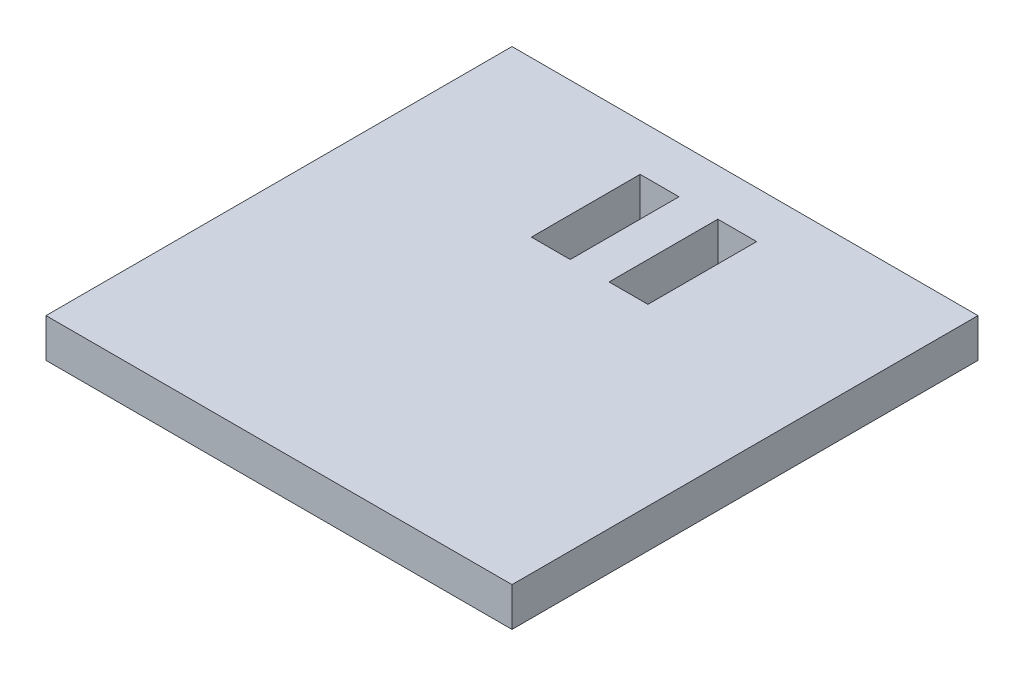
ISO-10303-21;
HEADER;
FILE_DESCRIPTION(('STEP AP214'),'2;1');
FILE_NAME('part.step','',(''),(''),'','','');
FILE_SCHEMA(('AUTOMOTIVE_DESIGN { 1 0 10303 214 1 1 1 1 }'));
ENDSEC;
DATA;
#1=APPLICATION_CONTEXT('core data for automotive mechanical design processes');
#2=APPLICATION_PROTOCOL_DEFINITION('international standard','automotive_design',2000,#1);
#3=PRODUCT_CONTEXT('',#1,'mechanical');
#4=PRODUCT('Part','Part','',(#3));
#5=PRODUCT_RELATED_PRODUCT_CATEGORY('part','',(#4));
#6=PRODUCT_DEFINITION_FORMATION('','',#4);
#7=PRODUCT_DEFINITION_CONTEXT('part definition',#1,'design');
#8=PRODUCT_DEFINITION('design','',#6,#7);
#9=PRODUCT_DEFINITION_SHAPE('','',#8);
#10=(LENGTH_UNIT() NAMED_UNIT(*) SI_UNIT(.MILLI.,.METRE.));
#11=(NAMED_UNIT(*) PLANE_ANGLE_UNIT() SI_UNIT($,.RADIAN.));
#12=(NAMED_UNIT(*) SI_UNIT($,.STERADIAN.) SOLID_ANGLE_UNIT());
#13=UNCERTAINTY_MEASURE_WITH_UNIT(LENGTH_MEASURE(1.E-05),#10,'distance_accuracy_value','');
#14=(GEOMETRIC_REPRESENTATION_CONTEXT(3) GLOBAL_UNCERTAINTY_ASSIGNED_CONTEXT((#13)) GLOBAL_UNIT_ASSIGNED_CONTEXT((#10,
#11,#12)) REPRESENTATION_CONTEXT('',''));
#15=CARTESIAN_POINT('',(0.,0.,0.));
#16=DIRECTION('',(0.,0.,1.));
#17=DIRECTION('',(1.,0.,0.));
#18=AXIS2_PLACEMENT_3D('',#15,#16,#17);
#19=CARTESIAN_POINT('',(0.,3.175,0.));
#20=DIRECTION('',(0.,-1.,0.));
#21=DIRECTION('',(0.,0.,-1.));
#22=AXIS2_PLACEMENT_3D('',#19,#20,#21);
#23=PLANE('',#22);
#24=DIRECTION('',(0.,0.,1.));
#25=VECTOR('',#24,1.);
#26=CARTESIAN_POINT('',(14.2875,3.175,-34.29));
#27=LINE('',#26,#25);
#28=CARTESIAN_POINT('',(14.2875,3.175,-34.29));
#29=VERTEX_POINT('',#28);
#30=CARTESIAN_POINT('',(14.2875,3.175,-25.4));
#31=VERTEX_POINT('',#30);
#32=EDGE_CURVE('E164',#29,#31,#27,.T.);
#33=ORIENTED_EDGE('',*,*,#32,.F.);
#34=DIRECTION('',(-1.,0.,0.));
#35=VECTOR('',#34,1.);
#36=CARTESIAN_POINT('',(14.2875,3.175,-34.29));
#37=LINE('',#36,#35);
#38=CARTESIAN_POINT('',(17.4625,3.175,-34.29));
#39=VERTEX_POINT('',#38);
#40=EDGE_CURVE('E172',#39,#29,#37,.T.);
#41=ORIENTED_EDGE('',*,*,#40,.F.);
#42=DIRECTION('',(0.,0.,-1.));
#43=VECTOR('',#42,1.);
#44=CARTESIAN_POINT('',(17.4625,3.175,-34.29));
#45=LINE('',#44,#43);
#46=CARTESIAN_POINT('',(17.4625,3.175,-25.4));
#47=VERTEX_POINT('',#46);
#48=EDGE_CURVE('E169',#47,#39,#45,.T.);
#49=ORIENTED_EDGE('',*,*,#48,.F.);
#50=DIRECTION('',(1.,0.,0.));
#51=VECTOR('',#50,1.);
#52=CARTESIAN_POINT('',(14.2875,3.175,-25.4));
#53=LINE('',#52,#51);
#54=EDGE_CURVE('E166',#31,#47,#53,.T.);
#55=ORIENTED_EDGE('',*,*,#54,.F.);
#56=EDGE_LOOP('',(#33,#41,#49,#55));
#57=FACE_BOUND('',#56,.T.);
#58=DIRECTION('',(0.,0.,1.));
#59=VECTOR('',#58,1.);
#60=CARTESIAN_POINT('',(0.,3.175,0.));
#61=LINE('',#60,#59);
#62=CARTESIAN_POINT('',(0.,3.175,-38.1));
#63=VERTEX_POINT('',#62);
#64=CARTESIAN_POINT('',(0.,3.175,0.));
#65=VERTEX_POINT('',#64);
#66=EDGE_CURVE('E195',#63,#65,#61,.T.);
#67=ORIENTED_EDGE('',*,*,#66,.T.);
#68=DIRECTION('',(1.,0.,0.));
#69=VECTOR('',#68,1.);
#70=CARTESIAN_POINT('',(0.,3.175,0.));
#71=LINE('',#70,#69);
#72=CARTESIAN_POINT('',(38.1,3.175,0.));
#73=VERTEX_POINT('',#72);
#74=EDGE_CURVE('E198',#65,#73,#71,.T.);
#75=ORIENTED_EDGE('',*,*,#74,.T.);
#76=DIRECTION('',(0.,0.,-1.));
#77=VECTOR('',#76,1.);
#78=CARTESIAN_POINT('',(38.1,3.175,0.));
#79=LINE('',#78,#77);
#80=CARTESIAN_POINT('',(38.1,3.175,-38.1));
#81=VERTEX_POINT('',#80);
#82=EDGE_CURVE('E201',#73,#81,#79,.T.);
#83=ORIENTED_EDGE('',*,*,#82,.T.);
#84=DIRECTION('',(-1.,0.,0.));
#85=VECTOR('',#84,1.);
#86=CARTESIAN_POINT('',(0.,3.175,-38.1));
#87=LINE('',#86,#85);
#88=EDGE_CURVE('E203',#81,#63,#87,.T.);
#89=ORIENTED_EDGE('',*,*,#88,.T.);
#90=EDGE_LOOP('',(#67,#75,#83,#89));
#91=FACE_BOUND('',#90,.T.);
#92=DIRECTION('',(0.,0.,1.));
#93=VECTOR('',#92,1.);
#94=CARTESIAN_POINT('',(20.6375,3.175,-34.29));
#95=LINE('',#94,#93);
#96=CARTESIAN_POINT('',(20.6375,3.175,-34.29));
#97=VERTEX_POINT('',#96);
#98=CARTESIAN_POINT('',(20.6375,3.175,-25.4));
#99=VERTEX_POINT('',#98);
#100=EDGE_CURVE('E128',#97,#99,#95,.T.);
#101=ORIENTED_EDGE('',*,*,#100,.F.);
#102=DIRECTION('',(-1.,0.,0.));
#103=VECTOR('',#102,1.);
#104=CARTESIAN_POINT('',(20.6375,3.175,-34.29));
#105=LINE('',#104,#103);
#106=CARTESIAN_POINT('',(23.8125,3.175,-34.29));
#107=VERTEX_POINT('',#106);
#108=EDGE_CURVE('E150',#107,#97,#105,.T.);
#109=ORIENTED_EDGE('',*,*,#108,.F.);
#110=DIRECTION('',(0.,0.,-1.));
#111=VECTOR('',#110,1.);
#112=CARTESIAN_POINT('',(23.8125,3.175,-34.29));
#113=LINE('',#112,#111);
#114=CARTESIAN_POINT('',(23.8125,3.175,-25.4));
#115=VERTEX_POINT('',#114);
#116=EDGE_CURVE('E148',#115,#107,#113,.T.);
#117=ORIENTED_EDGE('',*,*,#116,.F.);
#118=DIRECTION('',(1.,0.,0.));
#119=VECTOR('',#118,1.);
#120=CARTESIAN_POINT('',(20.6375,3.175,-25.4));
#121=LINE('',#120,#119);
#122=EDGE_CURVE('E136',#99,#115,#121,.T.);
#123=ORIENTED_EDGE('',*,*,#122,.F.);
#124=EDGE_LOOP('',(#101,#109,#117,#123));
#125=FACE_BOUND('',#124,.T.);
#126=ADVANCED_FACE('F39',(#57,#91,#125),#23,.F.);
#127=CARTESIAN_POINT('',(0.,0.,0.));
#128=DIRECTION('',(0.,-1.,0.));
#129=DIRECTION('',(0.,0.,-1.));
#130=AXIS2_PLACEMENT_3D('',#127,#128,#129);
#131=PLANE('',#130);
#132=DIRECTION('',(0.,0.,1.));
#133=VECTOR('',#132,1.);
#134=CARTESIAN_POINT('',(0.,0.,0.));
#135=LINE('',#134,#133);
#136=CARTESIAN_POINT('',(0.,0.,-38.1));
#137=VERTEX_POINT('',#136);
#138=CARTESIAN_POINT('',(0.,0.,0.));
#139=VERTEX_POINT('',#138);
#140=EDGE_CURVE('E194',#137,#139,#135,.T.);
#141=ORIENTED_EDGE('',*,*,#140,.F.);
#142=DIRECTION('',(-1.,0.,0.));
#143=VECTOR('',#142,1.);
#144=CARTESIAN_POINT('',(0.,0.,-38.1));
#145=LINE('',#144,#143);
#146=CARTESIAN_POINT('',(38.1,0.,-38.1));
#147=VERTEX_POINT('',#146);
#148=EDGE_CURVE('E199',#147,#137,#145,.T.);
#149=ORIENTED_EDGE('',*,*,#148,.F.);
#150=DIRECTION('',(0.,0.,-1.));
#151=VECTOR('',#150,1.);
#152=CARTESIAN_POINT('',(38.1,0.,0.));
#153=LINE('',#152,#151);
#154=CARTESIAN_POINT('',(38.1,0.,0.));
#155=VERTEX_POINT('',#154);
#156=EDGE_CURVE('E210',#155,#147,#153,.T.);
#157=ORIENTED_EDGE('',*,*,#156,.F.);
#158=DIRECTION('',(1.,0.,0.));
#159=VECTOR('',#158,1.);
#160=CARTESIAN_POINT('',(0.,0.,0.));
#161=LINE('',#160,#159);
#162=EDGE_CURVE('E208',#139,#155,#161,.T.);
#163=ORIENTED_EDGE('',*,*,#162,.F.);
#164=EDGE_LOOP('',(#141,#149,#157,#163));
#165=FACE_BOUND('',#164,.T.);
#166=DIRECTION('',(-1.,0.,0.));
#167=VECTOR('',#166,1.);
#168=CARTESIAN_POINT('',(14.2875,0.,-34.29));
#169=LINE('',#168,#167);
#170=CARTESIAN_POINT('',(17.4625,0.,-34.29));
#171=VERTEX_POINT('',#170);
#172=CARTESIAN_POINT('',(14.2875,0.,-34.29));
#173=VERTEX_POINT('',#172);
#174=EDGE_CURVE('E167',#171,#173,#169,.T.);
#175=ORIENTED_EDGE('',*,*,#174,.T.);
#176=DIRECTION('',(0.,0.,1.));
#177=VECTOR('',#176,1.);
#178=CARTESIAN_POINT('',(14.2875,0.,-34.29));
#179=LINE('',#178,#177);
#180=CARTESIAN_POINT('',(14.2875,0.,-25.4));
#181=VERTEX_POINT('',#180);
#182=EDGE_CURVE('E144',#173,#181,#179,.T.);
#183=ORIENTED_EDGE('',*,*,#182,.T.);
#184=DIRECTION('',(1.,0.,0.));
#185=VECTOR('',#184,1.);
#186=CARTESIAN_POINT('',(14.2875,0.,-25.4));
#187=LINE('',#186,#185);
#188=CARTESIAN_POINT('',(17.4625,0.,-25.4));
#189=VERTEX_POINT('',#188);
#190=EDGE_CURVE('E177',#181,#189,#187,.T.);
#191=ORIENTED_EDGE('',*,*,#190,.T.);
#192=DIRECTION('',(0.,0.,-1.));
#193=VECTOR('',#192,1.);
#194=CARTESIAN_POINT('',(17.4625,0.,-34.29));
#195=LINE('',#194,#193);
#196=EDGE_CURVE('E180',#189,#171,#195,.T.);
#197=ORIENTED_EDGE('',*,*,#196,.T.);
#198=EDGE_LOOP('',(#175,#183,#191,#197));
#199=FACE_BOUND('',#198,.T.);
#200=DIRECTION('',(-1.,0.,0.));
#201=VECTOR('',#200,1.);
#202=CARTESIAN_POINT('',(20.6375,0.,-34.29));
#203=LINE('',#202,#201);
#204=CARTESIAN_POINT('',(23.8125,0.,-34.29));
#205=VERTEX_POINT('',#204);
#206=CARTESIAN_POINT('',(20.6375,0.,-34.29));
#207=VERTEX_POINT('',#206);
#208=EDGE_CURVE('E137',#205,#207,#203,.T.);
#209=ORIENTED_EDGE('',*,*,#208,.T.);
#210=DIRECTION('',(0.,0.,1.));
#211=VECTOR('',#210,1.);
#212=CARTESIAN_POINT('',(20.6375,0.,-34.29));
#213=LINE('',#212,#211);
#214=CARTESIAN_POINT('',(20.6375,0.,-25.4));
#215=VERTEX_POINT('',#214);
#216=EDGE_CURVE('E62',#207,#215,#213,.T.);
#217=ORIENTED_EDGE('',*,*,#216,.T.);
#218=DIRECTION('',(1.,0.,0.));
#219=VECTOR('',#218,1.);
#220=CARTESIAN_POINT('',(20.6375,0.,-25.4));
#221=LINE('',#220,#219);
#222=CARTESIAN_POINT('',(23.8125,0.,-25.4));
#223=VERTEX_POINT('',#222);
#224=EDGE_CURVE('E143',#215,#223,#221,.T.);
#225=ORIENTED_EDGE('',*,*,#224,.T.);
#226=DIRECTION('',(0.,0.,-1.));
#227=VECTOR('',#226,1.);
#228=CARTESIAN_POINT('',(23.8125,0.,-34.29));
#229=LINE('',#228,#227);
#230=EDGE_CURVE('E156',#223,#205,#229,.T.);
#231=ORIENTED_EDGE('',*,*,#230,.T.);
#232=EDGE_LOOP('',(#209,#217,#225,#231));
#233=FACE_BOUND('',#232,.T.);
#234=ADVANCED_FACE('F228',(#165,#199,#233),#131,.T.);
#235=CARTESIAN_POINT('',(0.,3.175,0.));
#236=DIRECTION('',(1.,0.,0.));
#237=DIRECTION('',(0.,0.,-1.));
#238=AXIS2_PLACEMENT_3D('',#235,#236,#237);
#239=PLANE('',#238);
#240=ORIENTED_EDGE('',*,*,#140,.T.);
#241=DIRECTION('',(0.,-1.,0.));
#242=VECTOR('',#241,1.);
#243=CARTESIAN_POINT('',(0.,3.175,0.));
#244=LINE('',#243,#242);
#245=EDGE_CURVE('E11',#65,#139,#244,.T.);
#246=ORIENTED_EDGE('',*,*,#245,.F.);
#247=ORIENTED_EDGE('',*,*,#66,.F.);
#248=DIRECTION('',(0.,-1.,0.));
#249=VECTOR('',#248,1.);
#250=CARTESIAN_POINT('',(0.,3.175,-38.1));
#251=LINE('',#250,#249);
#252=EDGE_CURVE('E205',#63,#137,#251,.T.);
#253=ORIENTED_EDGE('',*,*,#252,.T.);
#254=EDGE_LOOP('',(#240,#246,#247,#253));
#255=FACE_BOUND('',#254,.T.);
#256=ADVANCED_FACE('F41',(#255),#239,.F.);
#257=CARTESIAN_POINT('',(0.,3.175,0.));
#258=DIRECTION('',(0.,0.,-1.));
#259=DIRECTION('',(-1.,0.,0.));
#260=AXIS2_PLACEMENT_3D('',#257,#258,#259);
#261=PLANE('',#260);
#262=ORIENTED_EDGE('',*,*,#162,.T.);
#263=DIRECTION('',(0.,-1.,0.));
#264=VECTOR('',#263,1.);
#265=CARTESIAN_POINT('',(38.1,3.175,0.));
#266=LINE('',#265,#264);
#267=EDGE_CURVE('E47',#73,#155,#266,.T.);
#268=ORIENTED_EDGE('',*,*,#267,.F.);
#269=ORIENTED_EDGE('',*,*,#74,.F.);
#270=ORIENTED_EDGE('',*,*,#245,.T.);
#271=EDGE_LOOP('',(#262,#268,#269,#270));
#272=FACE_BOUND('',#271,.T.);
#273=ADVANCED_FACE('F238',(#272),#261,.F.);
#274=CARTESIAN_POINT('',(38.1,3.175,0.));
#275=DIRECTION('',(-1.,0.,0.));
#276=DIRECTION('',(0.,0.,1.));
#277=AXIS2_PLACEMENT_3D('',#274,#275,#276);
#278=PLANE('',#277);
#279=ORIENTED_EDGE('',*,*,#156,.T.);
#280=DIRECTION('',(0.,-1.,0.));
#281=VECTOR('',#280,1.);
#282=CARTESIAN_POINT('',(38.1,3.175,-38.1));
#283=LINE('',#282,#281);
#284=EDGE_CURVE('E215',#81,#147,#283,.T.);
#285=ORIENTED_EDGE('',*,*,#284,.F.);
#286=ORIENTED_EDGE('',*,*,#82,.F.);
#287=ORIENTED_EDGE('',*,*,#267,.T.);
#288=EDGE_LOOP('',(#279,#285,#286,#287));
#289=FACE_BOUND('',#288,.T.);
#290=ADVANCED_FACE('F222',(#289),#278,.F.);
#291=CARTESIAN_POINT('',(0.,3.175,-38.1));
#292=DIRECTION('',(0.,0.,1.));
#293=DIRECTION('',(1.,0.,0.));
#294=AXIS2_PLACEMENT_3D('',#291,#292,#293);
#295=PLANE('',#294);
#296=ORIENTED_EDGE('',*,*,#148,.T.);
#297=ORIENTED_EDGE('',*,*,#252,.F.);
#298=ORIENTED_EDGE('',*,*,#88,.F.);
#299=ORIENTED_EDGE('',*,*,#284,.T.);
#300=EDGE_LOOP('',(#296,#297,#298,#299));
#301=FACE_BOUND('',#300,.T.);
#302=ADVANCED_FACE('F232',(#301),#295,.F.);
#303=CARTESIAN_POINT('',(14.2875,3.175,-34.29));
#304=DIRECTION('',(1.,0.,0.));
#305=DIRECTION('',(0.,0.,-1.));
#306=AXIS2_PLACEMENT_3D('',#303,#304,#305);
#307=PLANE('',#306);
#308=ORIENTED_EDGE('',*,*,#182,.F.);
#309=DIRECTION('',(0.,-1.,0.));
#310=VECTOR('',#309,1.);
#311=CARTESIAN_POINT('',(14.2875,3.175,-34.29));
#312=LINE('',#311,#310);
#313=EDGE_CURVE('E174',#29,#173,#312,.T.);
#314=ORIENTED_EDGE('',*,*,#313,.F.);
#315=ORIENTED_EDGE('',*,*,#32,.T.);
#316=DIRECTION('',(0.,-1.,0.));
#317=VECTOR('',#316,1.);
#318=CARTESIAN_POINT('',(14.2875,3.175,-25.4));
#319=LINE('',#318,#317);
#320=EDGE_CURVE('E191',#31,#181,#319,.T.);
#321=ORIENTED_EDGE('',*,*,#320,.T.);
#322=EDGE_LOOP('',(#308,#314,#315,#321));
#323=FACE_BOUND('',#322,.T.);
#324=ADVANCED_FACE('F254',(#323),#307,.T.);
#325=CARTESIAN_POINT('',(14.2875,3.175,-25.4));
#326=DIRECTION('',(0.,0.,-1.));
#327=DIRECTION('',(-1.,0.,0.));
#328=AXIS2_PLACEMENT_3D('',#325,#326,#327);
#329=PLANE('',#328);
#330=ORIENTED_EDGE('',*,*,#190,.F.);
#331=ORIENTED_EDGE('',*,*,#320,.F.);
#332=ORIENTED_EDGE('',*,*,#54,.T.);
#333=DIRECTION('',(0.,-1.,0.));
#334=VECTOR('',#333,1.);
#335=CARTESIAN_POINT('',(17.4625,3.175,-25.4));
#336=LINE('',#335,#334);
#337=EDGE_CURVE('E189',#47,#189,#336,.T.);
#338=ORIENTED_EDGE('',*,*,#337,.T.);
#339=EDGE_LOOP('',(#330,#331,#332,#338));
#340=FACE_BOUND('',#339,.T.);
#341=ADVANCED_FACE('F261',(#340),#329,.T.);
#342=CARTESIAN_POINT('',(17.4625,3.175,-34.29));
#343=DIRECTION('',(-1.,0.,0.));
#344=DIRECTION('',(0.,0.,1.));
#345=AXIS2_PLACEMENT_3D('',#342,#343,#344);
#346=PLANE('',#345);
#347=ORIENTED_EDGE('',*,*,#196,.F.);
#348=ORIENTED_EDGE('',*,*,#337,.F.);
#349=ORIENTED_EDGE('',*,*,#48,.T.);
#350=DIRECTION('',(0.,-1.,0.));
#351=VECTOR('',#350,1.);
#352=CARTESIAN_POINT('',(17.4625,3.175,-34.29));
#353=LINE('',#352,#351);
#354=EDGE_CURVE('E187',#39,#171,#353,.T.);
#355=ORIENTED_EDGE('',*,*,#354,.T.);
#356=EDGE_LOOP('',(#347,#348,#349,#355));
#357=FACE_BOUND('',#356,.T.);
#358=ADVANCED_FACE('F266',(#357),#346,.T.);
#359=CARTESIAN_POINT('',(14.2875,3.175,-34.29));
#360=DIRECTION('',(0.,0.,1.));
#361=DIRECTION('',(1.,0.,0.));
#362=AXIS2_PLACEMENT_3D('',#359,#360,#361);
#363=PLANE('',#362);
#364=ORIENTED_EDGE('',*,*,#174,.F.);
#365=ORIENTED_EDGE('',*,*,#354,.F.);
#366=ORIENTED_EDGE('',*,*,#40,.T.);
#367=ORIENTED_EDGE('',*,*,#313,.T.);
#368=EDGE_LOOP('',(#364,#365,#366,#367));
#369=FACE_BOUND('',#368,.T.);
#370=ADVANCED_FACE('F272',(#369),#363,.T.);
#371=CARTESIAN_POINT('',(20.6375,3.175,-34.29));
#372=DIRECTION('',(1.,0.,0.));
#373=DIRECTION('',(0.,0.,-1.));
#374=AXIS2_PLACEMENT_3D('',#371,#372,#373);
#375=PLANE('',#374);
#376=ORIENTED_EDGE('',*,*,#216,.F.);
#377=DIRECTION('',(0.,-1.,0.));
#378=VECTOR('',#377,1.);
#379=CARTESIAN_POINT('',(20.6375,3.175,-34.29));
#380=LINE('',#379,#378);
#381=EDGE_CURVE('E132',#97,#207,#380,.T.);
#382=ORIENTED_EDGE('',*,*,#381,.F.);
#383=ORIENTED_EDGE('',*,*,#100,.T.);
#384=DIRECTION('',(0.,-1.,0.));
#385=VECTOR('',#384,1.);
#386=CARTESIAN_POINT('',(20.6375,3.175,-25.4));
#387=LINE('',#386,#385);
#388=EDGE_CURVE('E131',#99,#215,#387,.T.);
#389=ORIENTED_EDGE('',*,*,#388,.T.);
#390=EDGE_LOOP('',(#376,#382,#383,#389));
#391=FACE_BOUND('',#390,.T.);
#392=ADVANCED_FACE('F130',(#391),#375,.T.);
#393=CARTESIAN_POINT('',(20.6375,3.175,-25.4));
#394=DIRECTION('',(0.,0.,-1.));
#395=DIRECTION('',(-1.,0.,0.));
#396=AXIS2_PLACEMENT_3D('',#393,#394,#395);
#397=PLANE('',#396);
#398=ORIENTED_EDGE('',*,*,#224,.F.);
#399=ORIENTED_EDGE('',*,*,#388,.F.);
#400=ORIENTED_EDGE('',*,*,#122,.T.);
#401=DIRECTION('',(0.,-1.,0.));
#402=VECTOR('',#401,1.);
#403=CARTESIAN_POINT('',(23.8125,3.175,-25.4));
#404=LINE('',#403,#402);
#405=EDGE_CURVE('E145',#115,#223,#404,.T.);
#406=ORIENTED_EDGE('',*,*,#405,.T.);
#407=EDGE_LOOP('',(#398,#399,#400,#406));
#408=FACE_BOUND('',#407,.T.);
#409=ADVANCED_FACE('F140',(#408),#397,.T.);
#410=CARTESIAN_POINT('',(23.8125,3.175,-34.29));
#411=DIRECTION('',(-1.,0.,0.));
#412=DIRECTION('',(0.,0.,1.));
#413=AXIS2_PLACEMENT_3D('',#410,#411,#412);
#414=PLANE('',#413);
#415=ORIENTED_EDGE('',*,*,#230,.F.);
#416=ORIENTED_EDGE('',*,*,#405,.F.);
#417=ORIENTED_EDGE('',*,*,#116,.T.);
#418=DIRECTION('',(0.,-1.,0.));
#419=VECTOR('',#418,1.);
#420=CARTESIAN_POINT('',(23.8125,3.175,-34.29));
#421=LINE('',#420,#419);
#422=EDGE_CURVE('E54',#107,#205,#421,.T.);
#423=ORIENTED_EDGE('',*,*,#422,.T.);
#424=EDGE_LOOP('',(#415,#416,#417,#423));
#425=FACE_BOUND('',#424,.T.);
#426=ADVANCED_FACE('F291',(#425),#414,.T.);
#427=CARTESIAN_POINT('',(20.6375,3.175,-34.29));
#428=DIRECTION('',(0.,0.,1.));
#429=DIRECTION('',(1.,0.,0.));
#430=AXIS2_PLACEMENT_3D('',#427,#428,#429);
#431=PLANE('',#430);
#432=ORIENTED_EDGE('',*,*,#208,.F.);
#433=ORIENTED_EDGE('',*,*,#422,.F.);
#434=ORIENTED_EDGE('',*,*,#108,.T.);
#435=ORIENTED_EDGE('',*,*,#381,.T.);
#436=EDGE_LOOP('',(#432,#433,#434,#435));
#437=FACE_BOUND('',#436,.T.);
#438=ADVANCED_FACE('F294',(#437),#431,.T.);
#439=CLOSED_SHELL('',(#126,#234,#256,#273,#290,#302,#324,#341,#358,#370,#392,#409,#426,#438));
#440=MANIFOLD_SOLID_BREP('B2',#439);
#441=ADVANCED_BREP_SHAPE_REPRESENTATION('',(#18,#440),#14);
#442=SHAPE_DEFINITION_REPRESENTATION(#9,#441);
ENDSEC;
END-ISO-10303-21;
